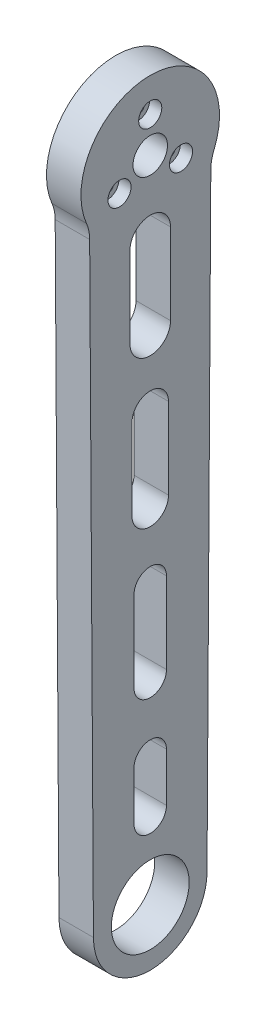
ISO-10303-21;
HEADER;
FILE_DESCRIPTION(('STEP AP214'),'2;1');
FILE_NAME('part.step','',(''),(''),'','','');
FILE_SCHEMA(('AUTOMOTIVE_DESIGN { 1 0 10303 214 1 1 1 1 }'));
ENDSEC;
DATA;
#1=APPLICATION_CONTEXT('core data for automotive mechanical design processes');
#2=APPLICATION_PROTOCOL_DEFINITION('international standard','automotive_design',2000,#1);
#3=PRODUCT_CONTEXT('',#1,'mechanical');
#4=PRODUCT('Part','Part','',(#3));
#5=PRODUCT_RELATED_PRODUCT_CATEGORY('part','',(#4));
#6=PRODUCT_DEFINITION_FORMATION('','',#4);
#7=PRODUCT_DEFINITION_CONTEXT('part definition',#1,'design');
#8=PRODUCT_DEFINITION('design','',#6,#7);
#9=PRODUCT_DEFINITION_SHAPE('','',#8);
#10=(LENGTH_UNIT() NAMED_UNIT(*) SI_UNIT(.MILLI.,.METRE.));
#11=(NAMED_UNIT(*) PLANE_ANGLE_UNIT() SI_UNIT($,.RADIAN.));
#12=(NAMED_UNIT(*) SI_UNIT($,.STERADIAN.) SOLID_ANGLE_UNIT());
#13=UNCERTAINTY_MEASURE_WITH_UNIT(LENGTH_MEASURE(1.E-05),#10,'distance_accuracy_value','');
#14=(GEOMETRIC_REPRESENTATION_CONTEXT(3) GLOBAL_UNCERTAINTY_ASSIGNED_CONTEXT((#13)) GLOBAL_UNIT_ASSIGNED_CONTEXT((#10,
#11,#12)) REPRESENTATION_CONTEXT('',''));
#15=CARTESIAN_POINT('',(0.,0.,0.));
#16=DIRECTION('',(0.,0.,1.));
#17=DIRECTION('',(1.,0.,0.));
#18=AXIS2_PLACEMENT_3D('',#15,#16,#17);
#19=CARTESIAN_POINT('',(-1.5,8.75,0.));
#20=DIRECTION('',(1.,0.,0.));
#21=DIRECTION('',(0.,0.,-1.));
#22=AXIS2_PLACEMENT_3D('',#19,#20,#21);
#23=CYLINDRICAL_SURFACE('',#22,1.6);
#24=CARTESIAN_POINT('',(0.,8.75,0.));
#25=DIRECTION('',(1.,0.,0.));
#26=DIRECTION('',(0.,0.,-1.));
#27=AXIS2_PLACEMENT_3D('',#24,#25,#26);
#28=CIRCLE('',#27,1.6);
#29=CARTESIAN_POINT('',(0.,8.75,-1.6));
#30=VERTEX_POINT('',#29);
#31=EDGE_CURVE('E340',#30,#30,#28,.T.);
#32=ORIENTED_EDGE('',*,*,#31,.F.);
#33=EDGE_LOOP('',(#32));
#34=FACE_BOUND('',#33,.T.);
#35=CARTESIAN_POINT('',(5.5,8.75,0.));
#36=DIRECTION('',(1.,0.,0.));
#37=DIRECTION('',(0.,0.,-1.));
#38=AXIS2_PLACEMENT_3D('',#35,#36,#37);
#39=CIRCLE('',#38,1.6);
#40=CARTESIAN_POINT('',(5.5,8.75,-1.6));
#41=VERTEX_POINT('',#40);
#42=EDGE_CURVE('E303',#41,#41,#39,.F.);
#43=ORIENTED_EDGE('',*,*,#42,.F.);
#44=EDGE_LOOP('',(#43));
#45=FACE_BOUND('',#44,.T.);
#46=ADVANCED_FACE('F38',(#34,#45),#23,.F.);
#47=CARTESIAN_POINT('',(-1.5,-4.37499999999967,-7.5777222831144));
#48=DIRECTION('',(1.,0.,0.));
#49=DIRECTION('',(0.,0.,-1.));
#50=AXIS2_PLACEMENT_3D('',#47,#48,#49);
#51=CYLINDRICAL_SURFACE('',#50,1.60000000000049);
#52=CARTESIAN_POINT('',(0.,-4.37499999999967,-7.5777222831144));
#53=DIRECTION('',(1.,0.,0.));
#54=DIRECTION('',(0.,0.,-1.));
#55=AXIS2_PLACEMENT_3D('',#52,#53,#54);
#56=CIRCLE('',#55,1.60000000000049);
#57=CARTESIAN_POINT('',(0.,-4.37499999999967,-9.17772228311489));
#58=VERTEX_POINT('',#57);
#59=EDGE_CURVE('E343',#58,#58,#56,.T.);
#60=ORIENTED_EDGE('',*,*,#59,.F.);
#61=EDGE_LOOP('',(#60));
#62=FACE_BOUND('',#61,.T.);
#63=CARTESIAN_POINT('',(5.5,-4.37499999999967,-7.5777222831144));
#64=DIRECTION('',(1.,0.,0.));
#65=DIRECTION('',(0.,0.,-1.));
#66=AXIS2_PLACEMENT_3D('',#63,#64,#65);
#67=CIRCLE('',#66,1.60000000000049);
#68=CARTESIAN_POINT('',(5.5,-4.37499999999967,-9.17772228311489));
#69=VERTEX_POINT('',#68);
#70=EDGE_CURVE('E350',#69,#69,#67,.F.);
#71=ORIENTED_EDGE('',*,*,#70,.F.);
#72=EDGE_LOOP('',(#71));
#73=FACE_BOUND('',#72,.T.);
#74=ADVANCED_FACE('F447',(#62,#73),#51,.F.);
#75=CARTESIAN_POINT('',(-1.5,-4.37500000000033,7.57772228311328));
#76=DIRECTION('',(1.,0.,0.));
#77=DIRECTION('',(0.,0.,-1.));
#78=AXIS2_PLACEMENT_3D('',#75,#76,#77);
#79=CYLINDRICAL_SURFACE('',#78,1.60000000000071);
#80=CARTESIAN_POINT('',(0.,-4.37500000000033,7.57772228311328));
#81=DIRECTION('',(1.,0.,0.));
#82=DIRECTION('',(0.,0.,-1.));
#83=AXIS2_PLACEMENT_3D('',#80,#81,#82);
#84=CIRCLE('',#83,1.60000000000071);
#85=CARTESIAN_POINT('',(0.,-4.37500000000033,5.97772228311258));
#86=VERTEX_POINT('',#85);
#87=EDGE_CURVE('E322',#86,#86,#84,.T.);
#88=ORIENTED_EDGE('',*,*,#87,.F.);
#89=EDGE_LOOP('',(#88));
#90=FACE_BOUND('',#89,.T.);
#91=CARTESIAN_POINT('',(5.5,-4.37500000000033,7.57772228311328));
#92=DIRECTION('',(1.,0.,0.));
#93=DIRECTION('',(0.,0.,-1.));
#94=AXIS2_PLACEMENT_3D('',#91,#92,#93);
#95=CIRCLE('',#94,1.60000000000071);
#96=CARTESIAN_POINT('',(5.5,-4.37500000000033,5.97772228311258));
#97=VERTEX_POINT('',#96);
#98=EDGE_CURVE('E284',#97,#97,#95,.F.);
#99=ORIENTED_EDGE('',*,*,#98,.F.);
#100=EDGE_LOOP('',(#99));
#101=FACE_BOUND('',#100,.T.);
#102=ADVANCED_FACE('F444',(#90,#101),#79,.F.);
#103=CARTESIAN_POINT('',(8.5,-0.0937463380336724,14.9994140853873));
#104=DIRECTION('',(0.,0.00624987793326379,-0.999980469322186));
#105=DIRECTION('',(0.,0.999980469322186,0.00624987793326379));
#106=AXIS2_PLACEMENT_3D('',#103,#104,#105);
#107=PLANE('',#106);
#108=DIRECTION('',(0.,-0.999980469322186,-0.00624987793326379));
#109=VECTOR('',#108,1.);
#110=CARTESIAN_POINT('',(8.5,-0.0937463380336724,14.9994140853873));
#111=LINE('',#110,#109);
#112=CARTESIAN_POINT('',(8.5,-10.5000468911661,14.9343747069302));
#113=VERTEX_POINT('',#112);
#114=CARTESIAN_POINT('',(8.5,-160.,14.));
#115=VERTEX_POINT('',#114);
#116=EDGE_CURVE('E304',#113,#115,#111,.T.);
#117=ORIENTED_EDGE('',*,*,#116,.F.);
#118=DIRECTION('',(1.,0.,0.));
#119=VECTOR('',#118,1.);
#120=CARTESIAN_POINT('',(0.,-10.5000468911661,14.9343747069302));
#121=LINE('',#120,#119);
#122=CARTESIAN_POINT('',(0.,-10.5000468911661,14.9343747069302));
#123=VERTEX_POINT('',#122);
#124=EDGE_CURVE('E399',#113,#123,#121,.F.);
#125=ORIENTED_EDGE('',*,*,#124,.T.);
#126=DIRECTION('',(0.,-0.999980469322186,-0.00624987793326379));
#127=VECTOR('',#126,1.);
#128=CARTESIAN_POINT('',(0.,-0.0937463380336724,14.9994140853873));
#129=LINE('',#128,#127);
#130=CARTESIAN_POINT('',(0.,-160.,14.));
#131=VERTEX_POINT('',#130);
#132=EDGE_CURVE('E319',#123,#131,#129,.T.);
#133=ORIENTED_EDGE('',*,*,#132,.T.);
#134=DIRECTION('',(-1.,0.,0.));
#135=VECTOR('',#134,1.);
#136=CARTESIAN_POINT('',(8.5,-160.,14.));
#137=LINE('',#136,#135);
#138=EDGE_CURVE('E334',#115,#131,#137,.T.);
#139=ORIENTED_EDGE('',*,*,#138,.F.);
#140=EDGE_LOOP('',(#117,#125,#133,#139));
#141=FACE_BOUND('',#140,.T.);
#142=ADVANCED_FACE('F422',(#141),#107,.F.);
#143=CARTESIAN_POINT('',(8.5,-160.,0.));
#144=DIRECTION('',(-1.,0.,0.));
#145=DIRECTION('',(0.,0.,1.));
#146=AXIS2_PLACEMENT_3D('',#143,#144,#145);
#147=CYLINDRICAL_SURFACE('',#146,14.);
#148=CARTESIAN_POINT('',(0.,-160.,0.));
#149=DIRECTION('',(1.,0.,0.));
#150=DIRECTION('',(0.,0.,-1.));
#151=AXIS2_PLACEMENT_3D('',#148,#149,#150);
#152=CIRCLE('',#151,14.);
#153=CARTESIAN_POINT('',(0.,-160.,-14.));
#154=VERTEX_POINT('',#153);
#155=EDGE_CURVE('E321',#131,#154,#152,.T.);
#156=ORIENTED_EDGE('',*,*,#155,.T.);
#157=DIRECTION('',(-1.,0.,0.));
#158=VECTOR('',#157,1.);
#159=CARTESIAN_POINT('',(8.5,-160.,-14.));
#160=LINE('',#159,#158);
#161=CARTESIAN_POINT('',(8.5,-160.,-14.));
#162=VERTEX_POINT('',#161);
#163=EDGE_CURVE('E318',#162,#154,#160,.T.);
#164=ORIENTED_EDGE('',*,*,#163,.F.);
#165=CARTESIAN_POINT('',(8.5,-160.,0.));
#166=DIRECTION('',(1.,0.,0.));
#167=DIRECTION('',(0.,0.,-1.));
#168=AXIS2_PLACEMENT_3D('',#165,#166,#167);
#169=CIRCLE('',#168,14.);
#170=EDGE_CURVE('E306',#115,#162,#169,.T.);
#171=ORIENTED_EDGE('',*,*,#170,.F.);
#172=ORIENTED_EDGE('',*,*,#138,.T.);
#173=EDGE_LOOP('',(#156,#164,#171,#172));
#174=FACE_BOUND('',#173,.T.);
#175=ADVANCED_FACE('F436',(#174),#147,.T.);
#176=CARTESIAN_POINT('',(8.5,-0.0937463380336724,-14.9994140853873));
#177=DIRECTION('',(0.,-0.00624987793326379,-0.999980469322186));
#178=DIRECTION('',(0.,0.999980469322186,-0.00624987793326379));
#179=AXIS2_PLACEMENT_3D('',#176,#177,#178);
#180=PLANE('',#179);
#181=DIRECTION('',(0.,-0.999980469322186,0.00624987793326379));
#182=VECTOR('',#181,1.);
#183=CARTESIAN_POINT('',(0.,-0.0937463380336724,-14.9994140853873));
#184=LINE('',#183,#182);
#185=CARTESIAN_POINT('',(0.,-10.5000468911661,-14.9343747069302));
#186=VERTEX_POINT('',#185);
#187=EDGE_CURVE('E325',#186,#154,#184,.T.);
#188=ORIENTED_EDGE('',*,*,#187,.F.);
#189=DIRECTION('',(-1.,0.,0.));
#190=VECTOR('',#189,1.);
#191=CARTESIAN_POINT('',(8.5,-10.5000468911661,-14.9343747069302));
#192=LINE('',#191,#190);
#193=CARTESIAN_POINT('',(8.5,-10.5000468911661,-14.9343747069302));
#194=VERTEX_POINT('',#193);
#195=EDGE_CURVE('E53',#186,#194,#192,.F.);
#196=ORIENTED_EDGE('',*,*,#195,.T.);
#197=DIRECTION('',(0.,-0.999980469322186,0.00624987793326379));
#198=VECTOR('',#197,1.);
#199=CARTESIAN_POINT('',(8.5,-0.0937463380336724,-14.9994140853873));
#200=LINE('',#199,#198);
#201=EDGE_CURVE('E310',#194,#162,#200,.T.);
#202=ORIENTED_EDGE('',*,*,#201,.T.);
#203=ORIENTED_EDGE('',*,*,#163,.T.);
#204=EDGE_LOOP('',(#188,#196,#202,#203));
#205=FACE_BOUND('',#204,.T.);
#206=ADVANCED_FACE('F434',(#205),#180,.T.);
#207=CARTESIAN_POINT('',(8.5,0.,0.));
#208=DIRECTION('',(-1.,0.,0.));
#209=DIRECTION('',(0.,0.,1.));
#210=AXIS2_PLACEMENT_3D('',#207,#208,#209);
#211=CYLINDRICAL_SURFACE('',#210,17.0791556995475);
#212=CARTESIAN_POINT('',(0.,0.,0.));
#213=DIRECTION('',(1.,0.,0.));
#214=DIRECTION('',(0.,0.,-1.));
#215=AXIS2_PLACEMENT_3D('',#212,#213,#214);
#216=CIRCLE('',#215,17.0791556995475);
#217=CARTESIAN_POINT('',(0.,-6.66192713287007,-15.726292833523));
#218=VERTEX_POINT('',#217);
#219=CARTESIAN_POINT('',(0.,-6.66192713287007,15.726292833523));
#220=VERTEX_POINT('',#219);
#221=EDGE_CURVE('E327',#218,#220,#216,.T.);
#222=ORIENTED_EDGE('',*,*,#221,.T.);
#223=DIRECTION('',(-1.,0.,0.));
#224=VECTOR('',#223,1.);
#225=CARTESIAN_POINT('',(8.5,-6.66192713287007,15.726292833523));
#226=LINE('',#225,#224);
#227=CARTESIAN_POINT('',(8.5,-6.66192713287007,15.726292833523));
#228=VERTEX_POINT('',#227);
#229=EDGE_CURVE('E405',#220,#228,#226,.F.);
#230=ORIENTED_EDGE('',*,*,#229,.T.);
#231=CARTESIAN_POINT('',(8.5,0.,0.));
#232=DIRECTION('',(1.,0.,0.));
#233=DIRECTION('',(0.,0.,-1.));
#234=AXIS2_PLACEMENT_3D('',#231,#232,#233);
#235=CIRCLE('',#234,17.0791556995475);
#236=CARTESIAN_POINT('',(8.5,-6.66192713287007,-15.726292833523));
#237=VERTEX_POINT('',#236);
#238=EDGE_CURVE('E312',#237,#228,#235,.T.);
#239=ORIENTED_EDGE('',*,*,#238,.F.);
#240=DIRECTION('',(-1.,0.,0.));
#241=VECTOR('',#240,1.);
#242=CARTESIAN_POINT('',(8.5,-6.66192713287007,-15.726292833523));
#243=LINE('',#242,#241);
#244=EDGE_CURVE('E402',#237,#218,#243,.T.);
#245=ORIENTED_EDGE('',*,*,#244,.T.);
#246=EDGE_LOOP('',(#222,#230,#239,#245));
#247=FACE_BOUND('',#246,.T.);
#248=ADVANCED_FACE('F429',(#247),#211,.T.);
#249=CARTESIAN_POINT('',(8.5,-160.,0.));
#250=DIRECTION('',(-1.,0.,0.));
#251=DIRECTION('',(0.,0.,1.));
#252=AXIS2_PLACEMENT_3D('',#249,#250,#251);
#253=CYLINDRICAL_SURFACE('',#252,9.6);
#254=CARTESIAN_POINT('',(8.5,-160.,0.));
#255=DIRECTION('',(1.,0.,0.));
#256=DIRECTION('',(0.,0.,-1.));
#257=AXIS2_PLACEMENT_3D('',#254,#255,#256);
#258=CIRCLE('',#257,9.6);
#259=CARTESIAN_POINT('',(8.5,-160.,-9.60000000000002));
#260=VERTEX_POINT('',#259);
#261=EDGE_CURVE('E315',#260,#260,#258,.T.);
#262=ORIENTED_EDGE('',*,*,#261,.T.);
#263=EDGE_LOOP('',(#262));
#264=FACE_BOUND('',#263,.T.);
#265=CARTESIAN_POINT('',(0.,-160.,0.));
#266=DIRECTION('',(1.,0.,0.));
#267=DIRECTION('',(0.,0.,-1.));
#268=AXIS2_PLACEMENT_3D('',#265,#266,#267);
#269=CIRCLE('',#268,9.6);
#270=CARTESIAN_POINT('',(0.,-160.,-9.60000000000002));
#271=VERTEX_POINT('',#270);
#272=EDGE_CURVE('E307',#271,#271,#269,.T.);
#273=ORIENTED_EDGE('',*,*,#272,.F.);
#274=EDGE_LOOP('',(#273));
#275=FACE_BOUND('',#274,.T.);
#276=ADVANCED_FACE('F471',(#264,#275),#253,.F.);
#277=CARTESIAN_POINT('',(8.5,0.,0.));
#278=DIRECTION('',(1.,0.,0.));
#279=DIRECTION('',(0.,0.,-1.));
#280=AXIS2_PLACEMENT_3D('',#277,#278,#279);
#281=PLANE('',#280);
#282=CARTESIAN_POINT('',(8.5,-17.7888259765087,0.));
#283=DIRECTION('',(1.,0.,0.));
#284=DIRECTION('',(0.,0.,-1.));
#285=AXIS2_PLACEMENT_3D('',#282,#283,#284);
#286=CIRCLE('',#285,5.);
#287=CARTESIAN_POINT('',(8.5,-17.7888259765087,-5.00000000000001));
#288=VERTEX_POINT('',#287);
#289=CARTESIAN_POINT('',(8.5,-17.7888259765087,5.));
#290=VERTEX_POINT('',#289);
#291=EDGE_CURVE('E206',#288,#290,#286,.T.);
#292=ORIENTED_EDGE('',*,*,#291,.F.);
#293=DIRECTION('',(0.,1.,0.));
#294=VECTOR('',#293,1.);
#295=CARTESIAN_POINT('',(8.5,-17.7888259765087,-5.00000000000001));
#296=LINE('',#295,#294);
#297=CARTESIAN_POINT('',(8.5,-37.7888259765087,-5.00000000000001));
#298=VERTEX_POINT('',#297);
#299=EDGE_CURVE('E211',#298,#288,#296,.T.);
#300=ORIENTED_EDGE('',*,*,#299,.F.);
#301=CARTESIAN_POINT('',(8.5,-37.7888259765087,0.));
#302=DIRECTION('',(1.,0.,0.));
#303=DIRECTION('',(0.,0.,-1.));
#304=AXIS2_PLACEMENT_3D('',#301,#302,#303);
#305=CIRCLE('',#304,5.);
#306=CARTESIAN_POINT('',(8.5,-37.7888259765087,5.));
#307=VERTEX_POINT('',#306);
#308=EDGE_CURVE('E190',#307,#298,#305,.T.);
#309=ORIENTED_EDGE('',*,*,#308,.F.);
#310=DIRECTION('',(0.,-1.,0.));
#311=VECTOR('',#310,1.);
#312=CARTESIAN_POINT('',(8.5,-17.7888259765087,5.));
#313=LINE('',#312,#311);
#314=EDGE_CURVE('E201',#290,#307,#313,.T.);
#315=ORIENTED_EDGE('',*,*,#314,.F.);
#316=EDGE_LOOP('',(#292,#300,#309,#315));
#317=FACE_BOUND('',#316,.T.);
#318=CARTESIAN_POINT('',(8.5,-54.7888259765087,0.));
#319=DIRECTION('',(1.,0.,0.));
#320=DIRECTION('',(0.,0.,-1.));
#321=AXIS2_PLACEMENT_3D('',#318,#319,#320);
#322=CIRCLE('',#321,4.50000000000002);
#323=CARTESIAN_POINT('',(8.5,-54.7888259765087,-4.50000000000003));
#324=VERTEX_POINT('',#323);
#325=CARTESIAN_POINT('',(8.5,-54.7888259765087,4.50000000000001));
#326=VERTEX_POINT('',#325);
#327=EDGE_CURVE('E221',#324,#326,#322,.T.);
#328=ORIENTED_EDGE('',*,*,#327,.F.);
#329=DIRECTION('',(0.,1.,0.));
#330=VECTOR('',#329,1.);
#331=CARTESIAN_POINT('',(8.5,-54.7888259765087,-4.50000000000003));
#332=LINE('',#331,#330);
#333=CARTESIAN_POINT('',(8.5,-74.7888259765087,-4.49999999999999));
#334=VERTEX_POINT('',#333);
#335=EDGE_CURVE('E230',#334,#324,#332,.T.);
#336=ORIENTED_EDGE('',*,*,#335,.F.);
#337=CARTESIAN_POINT('',(8.5,-74.7888259765087,0.));
#338=DIRECTION('',(1.,0.,0.));
#339=DIRECTION('',(0.,0.,-1.));
#340=AXIS2_PLACEMENT_3D('',#337,#338,#339);
#341=CIRCLE('',#340,4.5);
#342=CARTESIAN_POINT('',(8.5,-74.7888259765087,4.49999999999999));
#343=VERTEX_POINT('',#342);
#344=EDGE_CURVE('E227',#343,#334,#341,.T.);
#345=ORIENTED_EDGE('',*,*,#344,.F.);
#346=DIRECTION('',(0.,-1.,0.));
#347=VECTOR('',#346,1.);
#348=CARTESIAN_POINT('',(8.5,-54.7888259765087,4.50000000000001));
#349=LINE('',#348,#347);
#350=EDGE_CURVE('E223',#326,#343,#349,.T.);
#351=ORIENTED_EDGE('',*,*,#350,.F.);
#352=EDGE_LOOP('',(#328,#336,#345,#351));
#353=FACE_BOUND('',#352,.T.);
#354=CARTESIAN_POINT('',(8.5,-91.7888259765087,0.));
#355=DIRECTION('',(1.,0.,0.));
#356=DIRECTION('',(0.,0.,-1.));
#357=AXIS2_PLACEMENT_3D('',#354,#355,#356);
#358=CIRCLE('',#357,4.);
#359=CARTESIAN_POINT('',(8.5,-91.7888259765087,-4.00000000000002));
#360=VERTEX_POINT('',#359);
#361=CARTESIAN_POINT('',(8.5,-91.7888259765087,3.99999999999999));
#362=VERTEX_POINT('',#361);
#363=EDGE_CURVE('E242',#360,#362,#358,.T.);
#364=ORIENTED_EDGE('',*,*,#363,.F.);
#365=DIRECTION('',(0.,1.,0.));
#366=VECTOR('',#365,1.);
#367=CARTESIAN_POINT('',(8.5,-91.7888259765087,-4.00000000000002));
#368=LINE('',#367,#366);
#369=CARTESIAN_POINT('',(8.5,-111.788825976509,-4.00000000000002));
#370=VERTEX_POINT('',#369);
#371=EDGE_CURVE('E251',#370,#360,#368,.T.);
#372=ORIENTED_EDGE('',*,*,#371,.F.);
#373=CARTESIAN_POINT('',(8.5,-111.788825976509,0.));
#374=DIRECTION('',(1.,0.,0.));
#375=DIRECTION('',(0.,0.,-1.));
#376=AXIS2_PLACEMENT_3D('',#373,#374,#375);
#377=CIRCLE('',#376,4.);
#378=CARTESIAN_POINT('',(8.5,-111.788825976509,3.99999999999998));
#379=VERTEX_POINT('',#378);
#380=EDGE_CURVE('E248',#379,#370,#377,.T.);
#381=ORIENTED_EDGE('',*,*,#380,.F.);
#382=DIRECTION('',(0.,-1.,0.));
#383=VECTOR('',#382,1.);
#384=CARTESIAN_POINT('',(8.5,-91.7888259765087,3.99999999999999));
#385=LINE('',#384,#383);
#386=EDGE_CURVE('E244',#362,#379,#385,.T.);
#387=ORIENTED_EDGE('',*,*,#386,.F.);
#388=EDGE_LOOP('',(#364,#372,#381,#387));
#389=FACE_BOUND('',#388,.T.);
#390=CARTESIAN_POINT('',(8.5,-128.788825976509,0.));
#391=DIRECTION('',(1.,0.,0.));
#392=DIRECTION('',(0.,0.,-1.));
#393=AXIS2_PLACEMENT_3D('',#390,#391,#392);
#394=CIRCLE('',#393,4.);
#395=CARTESIAN_POINT('',(8.5,-128.788825976509,-4.00000000000002));
#396=VERTEX_POINT('',#395);
#397=CARTESIAN_POINT('',(8.5,-128.788825976509,3.99999999999998));
#398=VERTEX_POINT('',#397);
#399=EDGE_CURVE('E262',#396,#398,#394,.T.);
#400=ORIENTED_EDGE('',*,*,#399,.F.);
#401=DIRECTION('',(0.,1.,0.));
#402=VECTOR('',#401,1.);
#403=CARTESIAN_POINT('',(8.5,-128.788825976509,-4.00000000000002));
#404=LINE('',#403,#402);
#405=CARTESIAN_POINT('',(8.5,-140.788825976509,-4.00000000000002));
#406=VERTEX_POINT('',#405);
#407=EDGE_CURVE('E270',#406,#396,#404,.T.);
#408=ORIENTED_EDGE('',*,*,#407,.F.);
#409=CARTESIAN_POINT('',(8.5,-140.788825976509,0.));
#410=DIRECTION('',(1.,0.,0.));
#411=DIRECTION('',(0.,0.,-1.));
#412=AXIS2_PLACEMENT_3D('',#409,#410,#411);
#413=CIRCLE('',#412,4.);
#414=CARTESIAN_POINT('',(8.5,-140.788825976509,3.99999999999998));
#415=VERTEX_POINT('',#414);
#416=EDGE_CURVE('E267',#415,#406,#413,.T.);
#417=ORIENTED_EDGE('',*,*,#416,.F.);
#418=DIRECTION('',(0.,-1.,0.));
#419=VECTOR('',#418,1.);
#420=CARTESIAN_POINT('',(8.5,-128.788825976509,3.99999999999998));
#421=LINE('',#420,#419);
#422=EDGE_CURVE('E264',#398,#415,#421,.T.);
#423=ORIENTED_EDGE('',*,*,#422,.F.);
#424=EDGE_LOOP('',(#400,#408,#417,#423));
#425=FACE_BOUND('',#424,.T.);
#426=CARTESIAN_POINT('',(8.5,8.75,0.));
#427=DIRECTION('',(1.,0.,0.));
#428=DIRECTION('',(0.,0.,-1.));
#429=AXIS2_PLACEMENT_3D('',#426,#427,#428);
#430=CIRCLE('',#429,2.85);
#431=CARTESIAN_POINT('',(8.5,8.75,-2.85));
#432=VERTEX_POINT('',#431);
#433=EDGE_CURVE('E285',#432,#432,#430,.T.);
#434=ORIENTED_EDGE('',*,*,#433,.F.);
#435=EDGE_LOOP('',(#434));
#436=FACE_BOUND('',#435,.T.);
#437=CARTESIAN_POINT('',(8.5,-4.37499999999967,-7.5777222831144));
#438=DIRECTION('',(1.,0.,0.));
#439=DIRECTION('',(0.,0.,-1.));
#440=AXIS2_PLACEMENT_3D('',#437,#438,#439);
#441=CIRCLE('',#440,2.85);
#442=CARTESIAN_POINT('',(8.5,-4.37499999999967,-10.4277222831144));
#443=VERTEX_POINT('',#442);
#444=EDGE_CURVE('E291',#443,#443,#441,.T.);
#445=ORIENTED_EDGE('',*,*,#444,.F.);
#446=EDGE_LOOP('',(#445));
#447=FACE_BOUND('',#446,.T.);
#448=CARTESIAN_POINT('',(8.5,-4.37500000000033,7.57772228311328));
#449=DIRECTION('',(1.,0.,0.));
#450=DIRECTION('',(0.,0.,-1.));
#451=AXIS2_PLACEMENT_3D('',#448,#449,#450);
#452=CIRCLE('',#451,2.85);
#453=CARTESIAN_POINT('',(8.5,-4.37500000000033,4.72772228311328));
#454=VERTEX_POINT('',#453);
#455=EDGE_CURVE('E218',#454,#454,#452,.T.);
#456=ORIENTED_EDGE('',*,*,#455,.F.);
#457=EDGE_LOOP('',(#456));
#458=FACE_BOUND('',#457,.T.);
#459=CARTESIAN_POINT('',(8.5,0.,0.));
#460=DIRECTION('',(1.,0.,0.));
#461=DIRECTION('',(0.,0.,-1.));
#462=AXIS2_PLACEMENT_3D('',#459,#460,#461);
#463=CIRCLE('',#462,4.25);
#464=CARTESIAN_POINT('',(8.5,0.,-4.25));
#465=VERTEX_POINT('',#464);
#466=EDGE_CURVE('E299',#465,#465,#463,.T.);
#467=ORIENTED_EDGE('',*,*,#466,.F.);
#468=EDGE_LOOP('',(#467));
#469=FACE_BOUND('',#468,.T.);
#470=ORIENTED_EDGE('',*,*,#238,.T.);
#471=CARTESIAN_POINT('',(8.5,-10.5625456704987,24.9341794001521));
#472=DIRECTION('',(1.,0.,0.));
#473=DIRECTION('',(0.,0.,-1.));
#474=AXIS2_PLACEMENT_3D('',#471,#472,#473);
#475=CIRCLE('',#474,10.);
#476=EDGE_CURVE('E410',#228,#113,#475,.F.);
#477=ORIENTED_EDGE('',*,*,#476,.T.);
#478=ORIENTED_EDGE('',*,*,#116,.T.);
#479=ORIENTED_EDGE('',*,*,#170,.T.);
#480=ORIENTED_EDGE('',*,*,#201,.F.);
#481=CARTESIAN_POINT('',(8.5,-10.5625456704987,-24.9341794001521));
#482=DIRECTION('',(1.,0.,0.));
#483=DIRECTION('',(0.,0.,-1.));
#484=AXIS2_PLACEMENT_3D('',#481,#482,#483);
#485=CIRCLE('',#484,10.);
#486=EDGE_CURVE('E11',#194,#237,#485,.F.);
#487=ORIENTED_EDGE('',*,*,#486,.T.);
#488=EDGE_LOOP('',(#470,#477,#478,#479,#480,#487));
#489=FACE_BOUND('',#488,.T.);
#490=ORIENTED_EDGE('',*,*,#261,.F.);
#491=EDGE_LOOP('',(#490));
#492=FACE_BOUND('',#491,.T.);
#493=ADVANCED_FACE('F208',(#317,#353,#389,#425,#436,#447,#458,#469,#489,#492),#281,.T.);
#494=CARTESIAN_POINT('',(0.,0.,0.));
#495=DIRECTION('',(1.,0.,0.));
#496=DIRECTION('',(0.,0.,-1.));
#497=AXIS2_PLACEMENT_3D('',#494,#495,#496);
#498=PLANE('',#497);
#499=DIRECTION('',(0.,1.,0.));
#500=VECTOR('',#499,1.);
#501=CARTESIAN_POINT('',(0.,0.,-5.));
#502=LINE('',#501,#500);
#503=CARTESIAN_POINT('',(0.,-37.7888259765087,-5.00000000000001));
#504=VERTEX_POINT('',#503);
#505=CARTESIAN_POINT('',(0.,-17.7888259765087,-5.00000000000001));
#506=VERTEX_POINT('',#505);
#507=EDGE_CURVE('E393',#504,#506,#502,.T.);
#508=ORIENTED_EDGE('',*,*,#507,.T.);
#509=CARTESIAN_POINT('',(0.,-17.7888259765087,0.));
#510=DIRECTION('',(1.,0.,0.));
#511=DIRECTION('',(0.,0.,-1.));
#512=AXIS2_PLACEMENT_3D('',#509,#510,#511);
#513=CIRCLE('',#512,5.);
#514=CARTESIAN_POINT('',(0.,-17.7888259765087,5.));
#515=VERTEX_POINT('',#514);
#516=EDGE_CURVE('E396',#506,#515,#513,.T.);
#517=ORIENTED_EDGE('',*,*,#516,.T.);
#518=DIRECTION('',(0.,-1.,0.));
#519=VECTOR('',#518,1.);
#520=CARTESIAN_POINT('',(0.,0.,5.));
#521=LINE('',#520,#519);
#522=CARTESIAN_POINT('',(0.,-37.7888259765087,4.99999999999999));
#523=VERTEX_POINT('',#522);
#524=EDGE_CURVE('E390',#515,#523,#521,.T.);
#525=ORIENTED_EDGE('',*,*,#524,.T.);
#526=CARTESIAN_POINT('',(0.,-37.7888259765087,0.));
#527=DIRECTION('',(1.,0.,0.));
#528=DIRECTION('',(0.,0.,-1.));
#529=AXIS2_PLACEMENT_3D('',#526,#527,#528);
#530=CIRCLE('',#529,5.);
#531=EDGE_CURVE('E193',#523,#504,#530,.T.);
#532=ORIENTED_EDGE('',*,*,#531,.T.);
#533=EDGE_LOOP('',(#508,#517,#525,#532));
#534=FACE_BOUND('',#533,.T.);
#535=DIRECTION('',(0.,1.,0.));
#536=VECTOR('',#535,1.);
#537=CARTESIAN_POINT('',(0.,0.,-4.50000000000013));
#538=LINE('',#537,#536);
#539=CARTESIAN_POINT('',(0.,-74.7888259765087,-4.49999999999999));
#540=VERTEX_POINT('',#539);
#541=CARTESIAN_POINT('',(0.,-54.7888259765087,-4.50000000000003));
#542=VERTEX_POINT('',#541);
#543=EDGE_CURVE('E384',#540,#542,#538,.T.);
#544=ORIENTED_EDGE('',*,*,#543,.T.);
#545=CARTESIAN_POINT('',(0.,-54.7888259765087,0.));
#546=DIRECTION('',(1.,0.,0.));
#547=DIRECTION('',(0.,0.,-1.));
#548=AXIS2_PLACEMENT_3D('',#545,#546,#547);
#549=CIRCLE('',#548,4.50000000000002);
#550=CARTESIAN_POINT('',(0.,-54.7888259765087,4.50000000000001));
#551=VERTEX_POINT('',#550);
#552=EDGE_CURVE('E387',#542,#551,#549,.T.);
#553=ORIENTED_EDGE('',*,*,#552,.T.);
#554=DIRECTION('',(0.,-1.,0.));
#555=VECTOR('',#554,1.);
#556=CARTESIAN_POINT('',(0.,0.,4.5));
#557=LINE('',#556,#555);
#558=CARTESIAN_POINT('',(0.,-74.7888259765087,4.50000000000001));
#559=VERTEX_POINT('',#558);
#560=EDGE_CURVE('E378',#551,#559,#557,.T.);
#561=ORIENTED_EDGE('',*,*,#560,.T.);
#562=CARTESIAN_POINT('',(0.,-74.7888259765087,0.));
#563=DIRECTION('',(1.,0.,0.));
#564=DIRECTION('',(0.,0.,-1.));
#565=AXIS2_PLACEMENT_3D('',#562,#563,#564);
#566=CIRCLE('',#565,4.5);
#567=EDGE_CURVE('E381',#559,#540,#566,.T.);
#568=ORIENTED_EDGE('',*,*,#567,.T.);
#569=EDGE_LOOP('',(#544,#553,#561,#568));
#570=FACE_BOUND('',#569,.T.);
#571=DIRECTION('',(0.,1.,0.));
#572=VECTOR('',#571,1.);
#573=CARTESIAN_POINT('',(0.,0.,-4.));
#574=LINE('',#573,#572);
#575=CARTESIAN_POINT('',(0.,-111.788825976509,-4.00000000000002));
#576=VERTEX_POINT('',#575);
#577=CARTESIAN_POINT('',(0.,-91.7888259765087,-4.00000000000002));
#578=VERTEX_POINT('',#577);
#579=EDGE_CURVE('E372',#576,#578,#574,.T.);
#580=ORIENTED_EDGE('',*,*,#579,.T.);
#581=CARTESIAN_POINT('',(0.,-91.7888259765087,0.));
#582=DIRECTION('',(1.,0.,0.));
#583=DIRECTION('',(0.,0.,-1.));
#584=AXIS2_PLACEMENT_3D('',#581,#582,#583);
#585=CIRCLE('',#584,4.);
#586=CARTESIAN_POINT('',(0.,-91.7888259765087,3.99999999999999));
#587=VERTEX_POINT('',#586);
#588=EDGE_CURVE('E375',#578,#587,#585,.T.);
#589=ORIENTED_EDGE('',*,*,#588,.T.);
#590=DIRECTION('',(0.,-1.,0.));
#591=VECTOR('',#590,1.);
#592=CARTESIAN_POINT('',(0.,0.,4.));
#593=LINE('',#592,#591);
#594=CARTESIAN_POINT('',(0.,-111.788825976509,3.99999999999998));
#595=VERTEX_POINT('',#594);
#596=EDGE_CURVE('E366',#587,#595,#593,.T.);
#597=ORIENTED_EDGE('',*,*,#596,.T.);
#598=CARTESIAN_POINT('',(0.,-111.788825976509,0.));
#599=DIRECTION('',(1.,0.,0.));
#600=DIRECTION('',(0.,0.,-1.));
#601=AXIS2_PLACEMENT_3D('',#598,#599,#600);
#602=CIRCLE('',#601,4.);
#603=EDGE_CURVE('E369',#595,#576,#602,.T.);
#604=ORIENTED_EDGE('',*,*,#603,.T.);
#605=EDGE_LOOP('',(#580,#589,#597,#604));
#606=FACE_BOUND('',#605,.T.);
#607=DIRECTION('',(0.,1.,0.));
#608=VECTOR('',#607,1.);
#609=CARTESIAN_POINT('',(0.,0.,-4.));
#610=LINE('',#609,#608);
#611=CARTESIAN_POINT('',(0.,-140.788825976509,-4.00000000000002));
#612=VERTEX_POINT('',#611);
#613=CARTESIAN_POINT('',(0.,-128.788825976509,-4.00000000000002));
#614=VERTEX_POINT('',#613);
#615=EDGE_CURVE('E360',#612,#614,#610,.T.);
#616=ORIENTED_EDGE('',*,*,#615,.T.);
#617=CARTESIAN_POINT('',(0.,-128.788825976509,0.));
#618=DIRECTION('',(1.,0.,0.));
#619=DIRECTION('',(0.,0.,-1.));
#620=AXIS2_PLACEMENT_3D('',#617,#618,#619);
#621=CIRCLE('',#620,4.);
#622=CARTESIAN_POINT('',(0.,-128.788825976509,3.99999999999998));
#623=VERTEX_POINT('',#622);
#624=EDGE_CURVE('E363',#614,#623,#621,.T.);
#625=ORIENTED_EDGE('',*,*,#624,.T.);
#626=DIRECTION('',(0.,-1.,0.));
#627=VECTOR('',#626,1.);
#628=CARTESIAN_POINT('',(0.,0.,4.));
#629=LINE('',#628,#627);
#630=CARTESIAN_POINT('',(0.,-140.788825976509,3.99999999999998));
#631=VERTEX_POINT('',#630);
#632=EDGE_CURVE('E337',#623,#631,#629,.T.);
#633=ORIENTED_EDGE('',*,*,#632,.T.);
#634=CARTESIAN_POINT('',(0.,-140.788825976509,0.));
#635=DIRECTION('',(1.,0.,0.));
#636=DIRECTION('',(0.,0.,-1.));
#637=AXIS2_PLACEMENT_3D('',#634,#635,#636);
#638=CIRCLE('',#637,4.);
#639=EDGE_CURVE('E357',#631,#612,#638,.T.);
#640=ORIENTED_EDGE('',*,*,#639,.T.);
#641=EDGE_LOOP('',(#616,#625,#633,#640));
#642=FACE_BOUND('',#641,.T.);
#643=ORIENTED_EDGE('',*,*,#87,.T.);
#644=EDGE_LOOP('',(#643));
#645=FACE_BOUND('',#644,.T.);
#646=ORIENTED_EDGE('',*,*,#59,.T.);
#647=EDGE_LOOP('',(#646));
#648=FACE_BOUND('',#647,.T.);
#649=ORIENTED_EDGE('',*,*,#31,.T.);
#650=EDGE_LOOP('',(#649));
#651=FACE_BOUND('',#650,.T.);
#652=CARTESIAN_POINT('',(0.,0.,0.));
#653=DIRECTION('',(1.,0.,0.));
#654=DIRECTION('',(0.,0.,-1.));
#655=AXIS2_PLACEMENT_3D('',#652,#653,#654);
#656=CIRCLE('',#655,4.25);
#657=CARTESIAN_POINT('',(0.,0.,-4.25));
#658=VERTEX_POINT('',#657);
#659=EDGE_CURVE('E302',#658,#658,#656,.T.);
#660=ORIENTED_EDGE('',*,*,#659,.T.);
#661=EDGE_LOOP('',(#660));
#662=FACE_BOUND('',#661,.T.);
#663=ORIENTED_EDGE('',*,*,#132,.F.);
#664=CARTESIAN_POINT('',(0.,-10.5625456704987,24.9341794001521));
#665=DIRECTION('',(1.,0.,0.));
#666=DIRECTION('',(0.,0.,-1.));
#667=AXIS2_PLACEMENT_3D('',#664,#665,#666);
#668=CIRCLE('',#667,10.);
#669=EDGE_CURVE('E408',#123,#220,#668,.T.);
#670=ORIENTED_EDGE('',*,*,#669,.T.);
#671=ORIENTED_EDGE('',*,*,#221,.F.);
#672=CARTESIAN_POINT('',(0.,-10.5625456704987,-24.9341794001521));
#673=DIRECTION('',(1.,0.,0.));
#674=DIRECTION('',(0.,0.,-1.));
#675=AXIS2_PLACEMENT_3D('',#672,#673,#674);
#676=CIRCLE('',#675,10.);
#677=EDGE_CURVE('E46',#218,#186,#676,.T.);
#678=ORIENTED_EDGE('',*,*,#677,.T.);
#679=ORIENTED_EDGE('',*,*,#187,.T.);
#680=ORIENTED_EDGE('',*,*,#155,.F.);
#681=EDGE_LOOP('',(#663,#670,#671,#678,#679,#680));
#682=FACE_BOUND('',#681,.T.);
#683=ORIENTED_EDGE('',*,*,#272,.T.);
#684=EDGE_LOOP('',(#683));
#685=FACE_BOUND('',#684,.T.);
#686=ADVANCED_FACE('F425',(#534,#570,#606,#642,#645,#648,#651,#662,#682,#685),#498,.F.);
#687=CARTESIAN_POINT('',(-1.5,0.,0.));
#688=DIRECTION('',(1.,0.,0.));
#689=DIRECTION('',(0.,0.,-1.));
#690=AXIS2_PLACEMENT_3D('',#687,#688,#689);
#691=CYLINDRICAL_SURFACE('',#690,4.25);
#692=ORIENTED_EDGE('',*,*,#466,.T.);
#693=EDGE_LOOP('',(#692));
#694=FACE_BOUND('',#693,.T.);
#695=ORIENTED_EDGE('',*,*,#659,.F.);
#696=EDGE_LOOP('',(#695));
#697=FACE_BOUND('',#696,.T.);
#698=ADVANCED_FACE('F464',(#694,#697),#691,.F.);
#699=CARTESIAN_POINT('',(5.5,-4.37500000000033,7.57772228311328));
#700=DIRECTION('',(1.,0.,0.));
#701=DIRECTION('',(0.,0.,-1.));
#702=AXIS2_PLACEMENT_3D('',#699,#700,#701);
#703=PLANE('',#702);
#704=CARTESIAN_POINT('',(5.5,-4.37500000000033,7.57772228311328));
#705=DIRECTION('',(1.,0.,0.));
#706=DIRECTION('',(0.,0.,-1.));
#707=AXIS2_PLACEMENT_3D('',#704,#705,#706);
#708=CIRCLE('',#707,2.85);
#709=CARTESIAN_POINT('',(5.5,-4.37500000000033,4.72772228311328));
#710=VERTEX_POINT('',#709);
#711=EDGE_CURVE('E294',#710,#710,#708,.T.);
#712=ORIENTED_EDGE('',*,*,#711,.T.);
#713=EDGE_LOOP('',(#712));
#714=FACE_BOUND('',#713,.T.);
#715=ORIENTED_EDGE('',*,*,#98,.T.);
#716=EDGE_LOOP('',(#715));
#717=FACE_BOUND('',#716,.T.);
#718=ADVANCED_FACE('F467',(#714,#717),#703,.T.);
#719=CARTESIAN_POINT('',(5.5,-4.37500000000033,7.57772228311328));
#720=DIRECTION('',(1.,0.,0.));
#721=DIRECTION('',(0.,0.,-1.));
#722=AXIS2_PLACEMENT_3D('',#719,#720,#721);
#723=CYLINDRICAL_SURFACE('',#722,2.85);
#724=ORIENTED_EDGE('',*,*,#711,.F.);
#725=EDGE_LOOP('',(#724));
#726=FACE_BOUND('',#725,.T.);
#727=ORIENTED_EDGE('',*,*,#455,.T.);
#728=EDGE_LOOP('',(#727));
#729=FACE_BOUND('',#728,.T.);
#730=ADVANCED_FACE('F458',(#726,#729),#723,.F.);
#731=CARTESIAN_POINT('',(5.5,-4.37499999999967,-7.5777222831144));
#732=DIRECTION('',(1.,0.,0.));
#733=DIRECTION('',(0.,0.,-1.));
#734=AXIS2_PLACEMENT_3D('',#731,#732,#733);
#735=PLANE('',#734);
#736=CARTESIAN_POINT('',(5.5,-4.37499999999967,-7.5777222831144));
#737=DIRECTION('',(1.,0.,0.));
#738=DIRECTION('',(0.,0.,-1.));
#739=AXIS2_PLACEMENT_3D('',#736,#737,#738);
#740=CIRCLE('',#739,2.85);
#741=CARTESIAN_POINT('',(5.5,-4.37499999999967,-10.4277222831144));
#742=VERTEX_POINT('',#741);
#743=EDGE_CURVE('E288',#742,#742,#740,.T.);
#744=ORIENTED_EDGE('',*,*,#743,.T.);
#745=EDGE_LOOP('',(#744));
#746=FACE_BOUND('',#745,.T.);
#747=ORIENTED_EDGE('',*,*,#70,.T.);
#748=EDGE_LOOP('',(#747));
#749=FACE_BOUND('',#748,.T.);
#750=ADVANCED_FACE('F513',(#746,#749),#735,.T.);
#751=CARTESIAN_POINT('',(5.5,-4.37499999999967,-7.5777222831144));
#752=DIRECTION('',(1.,0.,0.));
#753=DIRECTION('',(0.,0.,-1.));
#754=AXIS2_PLACEMENT_3D('',#751,#752,#753);
#755=CYLINDRICAL_SURFACE('',#754,2.85);
#756=ORIENTED_EDGE('',*,*,#743,.F.);
#757=EDGE_LOOP('',(#756));
#758=FACE_BOUND('',#757,.T.);
#759=ORIENTED_EDGE('',*,*,#444,.T.);
#760=EDGE_LOOP('',(#759));
#761=FACE_BOUND('',#760,.T.);
#762=ADVANCED_FACE('F520',(#758,#761),#755,.F.);
#763=CARTESIAN_POINT('',(5.5,8.75,0.));
#764=DIRECTION('',(1.,0.,0.));
#765=DIRECTION('',(0.,0.,-1.));
#766=AXIS2_PLACEMENT_3D('',#763,#764,#765);
#767=PLANE('',#766);
#768=CARTESIAN_POINT('',(5.5,8.75,0.));
#769=DIRECTION('',(1.,0.,0.));
#770=DIRECTION('',(0.,0.,-1.));
#771=AXIS2_PLACEMENT_3D('',#768,#769,#770);
#772=CIRCLE('',#771,2.85);
#773=CARTESIAN_POINT('',(5.5,8.75,-2.85));
#774=VERTEX_POINT('',#773);
#775=EDGE_CURVE('E281',#774,#774,#772,.T.);
#776=ORIENTED_EDGE('',*,*,#775,.T.);
#777=EDGE_LOOP('',(#776));
#778=FACE_BOUND('',#777,.T.);
#779=ORIENTED_EDGE('',*,*,#42,.T.);
#780=EDGE_LOOP('',(#779));
#781=FACE_BOUND('',#780,.T.);
#782=ADVANCED_FACE('F528',(#778,#781),#767,.T.);
#783=CARTESIAN_POINT('',(5.5,8.75,0.));
#784=DIRECTION('',(1.,0.,0.));
#785=DIRECTION('',(0.,0.,-1.));
#786=AXIS2_PLACEMENT_3D('',#783,#784,#785);
#787=CYLINDRICAL_SURFACE('',#786,2.85);
#788=ORIENTED_EDGE('',*,*,#775,.F.);
#789=EDGE_LOOP('',(#788));
#790=FACE_BOUND('',#789,.T.);
#791=ORIENTED_EDGE('',*,*,#433,.T.);
#792=EDGE_LOOP('',(#791));
#793=FACE_BOUND('',#792,.T.);
#794=ADVANCED_FACE('F536',(#790,#793),#787,.F.);
#795=CARTESIAN_POINT('',(-1.5,-128.788825976509,0.));
#796=DIRECTION('',(1.,0.,0.));
#797=DIRECTION('',(0.,0.,-1.));
#798=AXIS2_PLACEMENT_3D('',#795,#796,#797);
#799=CYLINDRICAL_SURFACE('',#798,4.);
#800=DIRECTION('',(1.,0.,0.));
#801=VECTOR('',#800,1.);
#802=CARTESIAN_POINT('',(-1.5,-128.788825976509,-4.00000000000002));
#803=LINE('',#802,#801);
#804=EDGE_CURVE('E245',#614,#396,#803,.T.);
#805=ORIENTED_EDGE('',*,*,#804,.T.);
#806=ORIENTED_EDGE('',*,*,#399,.T.);
#807=DIRECTION('',(1.,0.,0.));
#808=VECTOR('',#807,1.);
#809=CARTESIAN_POINT('',(-1.5,-128.788825976509,3.99999999999998));
#810=LINE('',#809,#808);
#811=EDGE_CURVE('E273',#623,#398,#810,.T.);
#812=ORIENTED_EDGE('',*,*,#811,.F.);
#813=ORIENTED_EDGE('',*,*,#624,.F.);
#814=EDGE_LOOP('',(#805,#806,#812,#813));
#815=FACE_BOUND('',#814,.T.);
#816=ADVANCED_FACE('F544',(#815),#799,.F.);
#817=CARTESIAN_POINT('',(-1.5,-128.788825976509,-4.00000000000002));
#818=DIRECTION('',(0.,0.,-1.));
#819=DIRECTION('',(0.,1.,0.));
#820=AXIS2_PLACEMENT_3D('',#817,#818,#819);
#821=PLANE('',#820);
#822=DIRECTION('',(1.,0.,0.));
#823=VECTOR('',#822,1.);
#824=CARTESIAN_POINT('',(-1.5,-140.788825976509,-4.00000000000002));
#825=LINE('',#824,#823);
#826=EDGE_CURVE('E275',#612,#406,#825,.T.);
#827=ORIENTED_EDGE('',*,*,#826,.T.);
#828=ORIENTED_EDGE('',*,*,#407,.T.);
#829=ORIENTED_EDGE('',*,*,#804,.F.);
#830=ORIENTED_EDGE('',*,*,#615,.F.);
#831=EDGE_LOOP('',(#827,#828,#829,#830));
#832=FACE_BOUND('',#831,.T.);
#833=ADVANCED_FACE('F552',(#832),#821,.F.);
#834=CARTESIAN_POINT('',(-1.5,-140.788825976509,0.));
#835=DIRECTION('',(1.,0.,0.));
#836=DIRECTION('',(0.,0.,-1.));
#837=AXIS2_PLACEMENT_3D('',#834,#835,#836);
#838=CYLINDRICAL_SURFACE('',#837,4.);
#839=DIRECTION('',(1.,0.,0.));
#840=VECTOR('',#839,1.);
#841=CARTESIAN_POINT('',(-1.5,-140.788825976509,3.99999999999998));
#842=LINE('',#841,#840);
#843=EDGE_CURVE('E277',#631,#415,#842,.T.);
#844=ORIENTED_EDGE('',*,*,#843,.T.);
#845=ORIENTED_EDGE('',*,*,#416,.T.);
#846=ORIENTED_EDGE('',*,*,#826,.F.);
#847=ORIENTED_EDGE('',*,*,#639,.F.);
#848=EDGE_LOOP('',(#844,#845,#846,#847));
#849=FACE_BOUND('',#848,.T.);
#850=ADVANCED_FACE('F560',(#849),#838,.F.);
#851=CARTESIAN_POINT('',(-1.5,-128.788825976509,3.99999999999998));
#852=DIRECTION('',(0.,0.,1.));
#853=DIRECTION('',(0.,-1.,0.));
#854=AXIS2_PLACEMENT_3D('',#851,#852,#853);
#855=PLANE('',#854);
#856=ORIENTED_EDGE('',*,*,#811,.T.);
#857=ORIENTED_EDGE('',*,*,#422,.T.);
#858=ORIENTED_EDGE('',*,*,#843,.F.);
#859=ORIENTED_EDGE('',*,*,#632,.F.);
#860=EDGE_LOOP('',(#856,#857,#858,#859));
#861=FACE_BOUND('',#860,.T.);
#862=ADVANCED_FACE('F568',(#861),#855,.F.);
#863=CARTESIAN_POINT('',(-1.5,-91.7888259765087,0.));
#864=DIRECTION('',(1.,0.,0.));
#865=DIRECTION('',(0.,0.,-1.));
#866=AXIS2_PLACEMENT_3D('',#863,#864,#865);
#867=CYLINDRICAL_SURFACE('',#866,4.);
#868=DIRECTION('',(1.,0.,0.));
#869=VECTOR('',#868,1.);
#870=CARTESIAN_POINT('',(-1.5,-91.7888259765087,-4.00000000000002));
#871=LINE('',#870,#869);
#872=EDGE_CURVE('E224',#578,#360,#871,.T.);
#873=ORIENTED_EDGE('',*,*,#872,.T.);
#874=ORIENTED_EDGE('',*,*,#363,.T.);
#875=DIRECTION('',(1.,0.,0.));
#876=VECTOR('',#875,1.);
#877=CARTESIAN_POINT('',(-1.5,-91.7888259765087,3.99999999999999));
#878=LINE('',#877,#876);
#879=EDGE_CURVE('E254',#587,#362,#878,.T.);
#880=ORIENTED_EDGE('',*,*,#879,.F.);
#881=ORIENTED_EDGE('',*,*,#588,.F.);
#882=EDGE_LOOP('',(#873,#874,#880,#881));
#883=FACE_BOUND('',#882,.T.);
#884=ADVANCED_FACE('F576',(#883),#867,.F.);
#885=CARTESIAN_POINT('',(-1.5,-91.7888259765087,-4.00000000000002));
#886=DIRECTION('',(0.,0.,-1.));
#887=DIRECTION('',(0.,1.,0.));
#888=AXIS2_PLACEMENT_3D('',#885,#886,#887);
#889=PLANE('',#888);
#890=DIRECTION('',(1.,0.,0.));
#891=VECTOR('',#890,1.);
#892=CARTESIAN_POINT('',(-1.5,-111.788825976509,-4.00000000000002));
#893=LINE('',#892,#891);
#894=EDGE_CURVE('E256',#576,#370,#893,.T.);
#895=ORIENTED_EDGE('',*,*,#894,.T.);
#896=ORIENTED_EDGE('',*,*,#371,.T.);
#897=ORIENTED_EDGE('',*,*,#872,.F.);
#898=ORIENTED_EDGE('',*,*,#579,.F.);
#899=EDGE_LOOP('',(#895,#896,#897,#898));
#900=FACE_BOUND('',#899,.T.);
#901=ADVANCED_FACE('F584',(#900),#889,.F.);
#902=CARTESIAN_POINT('',(-1.5,-111.788825976509,0.));
#903=DIRECTION('',(1.,0.,0.));
#904=DIRECTION('',(0.,0.,-1.));
#905=AXIS2_PLACEMENT_3D('',#902,#903,#904);
#906=CYLINDRICAL_SURFACE('',#905,4.);
#907=DIRECTION('',(1.,0.,0.));
#908=VECTOR('',#907,1.);
#909=CARTESIAN_POINT('',(-1.5,-111.788825976509,3.99999999999998));
#910=LINE('',#909,#908);
#911=EDGE_CURVE('E258',#595,#379,#910,.T.);
#912=ORIENTED_EDGE('',*,*,#911,.T.);
#913=ORIENTED_EDGE('',*,*,#380,.T.);
#914=ORIENTED_EDGE('',*,*,#894,.F.);
#915=ORIENTED_EDGE('',*,*,#603,.F.);
#916=EDGE_LOOP('',(#912,#913,#914,#915));
#917=FACE_BOUND('',#916,.T.);
#918=ADVANCED_FACE('F592',(#917),#906,.F.);
#919=CARTESIAN_POINT('',(-1.5,-91.7888259765087,3.99999999999999));
#920=DIRECTION('',(0.,0.,1.));
#921=DIRECTION('',(0.,-1.,0.));
#922=AXIS2_PLACEMENT_3D('',#919,#920,#921);
#923=PLANE('',#922);
#924=ORIENTED_EDGE('',*,*,#879,.T.);
#925=ORIENTED_EDGE('',*,*,#386,.T.);
#926=ORIENTED_EDGE('',*,*,#911,.F.);
#927=ORIENTED_EDGE('',*,*,#596,.F.);
#928=EDGE_LOOP('',(#924,#925,#926,#927));
#929=FACE_BOUND('',#928,.T.);
#930=ADVANCED_FACE('F600',(#929),#923,.F.);
#931=CARTESIAN_POINT('',(-1.5,-54.7888259765087,0.));
#932=DIRECTION('',(1.,0.,0.));
#933=DIRECTION('',(0.,0.,-1.));
#934=AXIS2_PLACEMENT_3D('',#931,#932,#933);
#935=CYLINDRICAL_SURFACE('',#934,4.50000000000002);
#936=DIRECTION('',(1.,0.,0.));
#937=VECTOR('',#936,1.);
#938=CARTESIAN_POINT('',(-1.5,-54.7888259765087,-4.50000000000003));
#939=LINE('',#938,#937);
#940=EDGE_CURVE('E234',#542,#324,#939,.T.);
#941=ORIENTED_EDGE('',*,*,#940,.T.);
#942=ORIENTED_EDGE('',*,*,#327,.T.);
#943=DIRECTION('',(1.,0.,0.));
#944=VECTOR('',#943,1.);
#945=CARTESIAN_POINT('',(-1.5,-54.7888259765087,4.50000000000001));
#946=LINE('',#945,#944);
#947=EDGE_CURVE('E233',#551,#326,#946,.T.);
#948=ORIENTED_EDGE('',*,*,#947,.F.);
#949=ORIENTED_EDGE('',*,*,#552,.F.);
#950=EDGE_LOOP('',(#941,#942,#948,#949));
#951=FACE_BOUND('',#950,.T.);
#952=ADVANCED_FACE('F608',(#951),#935,.F.);
#953=CARTESIAN_POINT('',(-1.5,-54.7888259765087,-4.50000000000003));
#954=DIRECTION('',(0.,0.,-1.));
#955=DIRECTION('',(0.,1.,0.));
#956=AXIS2_PLACEMENT_3D('',#953,#954,#955);
#957=PLANE('',#956);
#958=DIRECTION('',(1.,0.,0.));
#959=VECTOR('',#958,1.);
#960=CARTESIAN_POINT('',(-1.5,-74.7888259765087,-4.49999999999999));
#961=LINE('',#960,#959);
#962=EDGE_CURVE('E236',#540,#334,#961,.T.);
#963=ORIENTED_EDGE('',*,*,#962,.T.);
#964=ORIENTED_EDGE('',*,*,#335,.T.);
#965=ORIENTED_EDGE('',*,*,#940,.F.);
#966=ORIENTED_EDGE('',*,*,#543,.F.);
#967=EDGE_LOOP('',(#963,#964,#965,#966));
#968=FACE_BOUND('',#967,.T.);
#969=ADVANCED_FACE('F616',(#968),#957,.F.);
#970=CARTESIAN_POINT('',(-1.5,-74.7888259765087,0.));
#971=DIRECTION('',(1.,0.,0.));
#972=DIRECTION('',(0.,0.,-1.));
#973=AXIS2_PLACEMENT_3D('',#970,#971,#972);
#974=CYLINDRICAL_SURFACE('',#973,4.5);
#975=DIRECTION('',(1.,0.,0.));
#976=VECTOR('',#975,1.);
#977=CARTESIAN_POINT('',(-1.5,-74.7888259765087,4.49999999999999));
#978=LINE('',#977,#976);
#979=EDGE_CURVE('E238',#559,#343,#978,.T.);
#980=ORIENTED_EDGE('',*,*,#979,.T.);
#981=ORIENTED_EDGE('',*,*,#344,.T.);
#982=ORIENTED_EDGE('',*,*,#962,.F.);
#983=ORIENTED_EDGE('',*,*,#567,.F.);
#984=EDGE_LOOP('',(#980,#981,#982,#983));
#985=FACE_BOUND('',#984,.T.);
#986=ADVANCED_FACE('F624',(#985),#974,.F.);
#987=CARTESIAN_POINT('',(-1.5,-54.7888259765087,4.50000000000001));
#988=DIRECTION('',(0.,0.,1.));
#989=DIRECTION('',(0.,-1.,0.));
#990=AXIS2_PLACEMENT_3D('',#987,#988,#989);
#991=PLANE('',#990);
#992=ORIENTED_EDGE('',*,*,#947,.T.);
#993=ORIENTED_EDGE('',*,*,#350,.T.);
#994=ORIENTED_EDGE('',*,*,#979,.F.);
#995=ORIENTED_EDGE('',*,*,#560,.F.);
#996=EDGE_LOOP('',(#992,#993,#994,#995));
#997=FACE_BOUND('',#996,.T.);
#998=ADVANCED_FACE('F632',(#997),#991,.F.);
#999=CARTESIAN_POINT('',(-1.5,-17.7888259765087,0.));
#1000=DIRECTION('',(1.,0.,0.));
#1001=DIRECTION('',(0.,0.,-1.));
#1002=AXIS2_PLACEMENT_3D('',#999,#1000,#1001);
#1003=CYLINDRICAL_SURFACE('',#1002,5.);
#1004=DIRECTION('',(1.,0.,0.));
#1005=VECTOR('',#1004,1.);
#1006=CARTESIAN_POINT('',(-1.5,-17.7888259765087,-5.00000000000001));
#1007=LINE('',#1006,#1005);
#1008=EDGE_CURVE('E216',#506,#288,#1007,.T.);
#1009=ORIENTED_EDGE('',*,*,#1008,.T.);
#1010=ORIENTED_EDGE('',*,*,#291,.T.);
#1011=DIRECTION('',(1.,0.,0.));
#1012=VECTOR('',#1011,1.);
#1013=CARTESIAN_POINT('',(-1.5,-17.7888259765087,5.));
#1014=LINE('',#1013,#1012);
#1015=EDGE_CURVE('E197',#515,#290,#1014,.T.);
#1016=ORIENTED_EDGE('',*,*,#1015,.F.);
#1017=ORIENTED_EDGE('',*,*,#516,.F.);
#1018=EDGE_LOOP('',(#1009,#1010,#1016,#1017));
#1019=FACE_BOUND('',#1018,.T.);
#1020=ADVANCED_FACE('F640',(#1019),#1003,.F.);
#1021=CARTESIAN_POINT('',(-1.5,-17.7888259765087,-5.00000000000001));
#1022=DIRECTION('',(0.,0.,-1.));
#1023=DIRECTION('',(0.,1.,0.));
#1024=AXIS2_PLACEMENT_3D('',#1021,#1022,#1023);
#1025=PLANE('',#1024);
#1026=DIRECTION('',(1.,0.,0.));
#1027=VECTOR('',#1026,1.);
#1028=CARTESIAN_POINT('',(-1.5,-37.7888259765087,-5.00000000000001));
#1029=LINE('',#1028,#1027);
#1030=EDGE_CURVE('E196',#504,#298,#1029,.T.);
#1031=ORIENTED_EDGE('',*,*,#1030,.T.);
#1032=ORIENTED_EDGE('',*,*,#299,.T.);
#1033=ORIENTED_EDGE('',*,*,#1008,.F.);
#1034=ORIENTED_EDGE('',*,*,#507,.F.);
#1035=EDGE_LOOP('',(#1031,#1032,#1033,#1034));
#1036=FACE_BOUND('',#1035,.T.);
#1037=ADVANCED_FACE('F648',(#1036),#1025,.F.);
#1038=CARTESIAN_POINT('',(-1.5,-37.7888259765087,0.));
#1039=DIRECTION('',(1.,0.,0.));
#1040=DIRECTION('',(0.,0.,-1.));
#1041=AXIS2_PLACEMENT_3D('',#1038,#1039,#1040);
#1042=CYLINDRICAL_SURFACE('',#1041,5.);
#1043=DIRECTION('',(1.,0.,0.));
#1044=VECTOR('',#1043,1.);
#1045=CARTESIAN_POINT('',(-1.5,-37.7888259765087,5.));
#1046=LINE('',#1045,#1044);
#1047=EDGE_CURVE('E185',#523,#307,#1046,.T.);
#1048=ORIENTED_EDGE('',*,*,#1047,.T.);
#1049=ORIENTED_EDGE('',*,*,#308,.T.);
#1050=ORIENTED_EDGE('',*,*,#1030,.F.);
#1051=ORIENTED_EDGE('',*,*,#531,.F.);
#1052=EDGE_LOOP('',(#1048,#1049,#1050,#1051));
#1053=FACE_BOUND('',#1052,.T.);
#1054=ADVANCED_FACE('F187',(#1053),#1042,.F.);
#1055=CARTESIAN_POINT('',(-1.5,-17.7888259765087,5.));
#1056=DIRECTION('',(0.,0.,1.));
#1057=DIRECTION('',(0.,-1.,0.));
#1058=AXIS2_PLACEMENT_3D('',#1055,#1056,#1057);
#1059=PLANE('',#1058);
#1060=ORIENTED_EDGE('',*,*,#1015,.T.);
#1061=ORIENTED_EDGE('',*,*,#314,.T.);
#1062=ORIENTED_EDGE('',*,*,#1047,.F.);
#1063=ORIENTED_EDGE('',*,*,#524,.F.);
#1064=EDGE_LOOP('',(#1060,#1061,#1062,#1063));
#1065=FACE_BOUND('',#1064,.T.);
#1066=ADVANCED_FACE('F202',(#1065),#1059,.F.);
#1067=CARTESIAN_POINT('',(8.5,-10.5625456704987,24.9341794001521));
#1068=DIRECTION('',(-1.,0.,0.));
#1069=DIRECTION('',(0.,0.,1.));
#1070=AXIS2_PLACEMENT_3D('',#1067,#1068,#1069);
#1071=CYLINDRICAL_SURFACE('',#1070,10.);
#1072=ORIENTED_EDGE('',*,*,#476,.F.);
#1073=ORIENTED_EDGE('',*,*,#229,.F.);
#1074=ORIENTED_EDGE('',*,*,#669,.F.);
#1075=ORIENTED_EDGE('',*,*,#124,.F.);
#1076=EDGE_LOOP('',(#1072,#1073,#1074,#1075));
#1077=FACE_BOUND('',#1076,.T.);
#1078=ADVANCED_FACE('F424',(#1077),#1071,.F.);
#1079=CARTESIAN_POINT('',(8.5,-10.5625456704987,-24.9341794001521));
#1080=DIRECTION('',(-1.,0.,0.));
#1081=DIRECTION('',(0.,0.,1.));
#1082=AXIS2_PLACEMENT_3D('',#1079,#1080,#1081);
#1083=CYLINDRICAL_SURFACE('',#1082,10.);
#1084=ORIENTED_EDGE('',*,*,#486,.F.);
#1085=ORIENTED_EDGE('',*,*,#195,.F.);
#1086=ORIENTED_EDGE('',*,*,#677,.F.);
#1087=ORIENTED_EDGE('',*,*,#244,.F.);
#1088=EDGE_LOOP('',(#1084,#1085,#1086,#1087));
#1089=FACE_BOUND('',#1088,.T.);
#1090=ADVANCED_FACE('F40',(#1089),#1083,.F.);
#1091=CLOSED_SHELL('',(#46,#74,#102,#142,#175,#206,#248,#276,#493,#686,#698,#718,#730,#750,#762,
#782,#794,#816,#833,#850,#862,#884,#901,#918,#930,#952,#969,#986,#998,#1020,#1037,#1054,#1066,
#1078,#1090));
#1092=MANIFOLD_SOLID_BREP('B2',#1091);
#1093=ADVANCED_BREP_SHAPE_REPRESENTATION('',(#18,#1092),#14);
#1094=SHAPE_DEFINITION_REPRESENTATION(#9,#1093);
ENDSEC;
END-ISO-10303-21;
